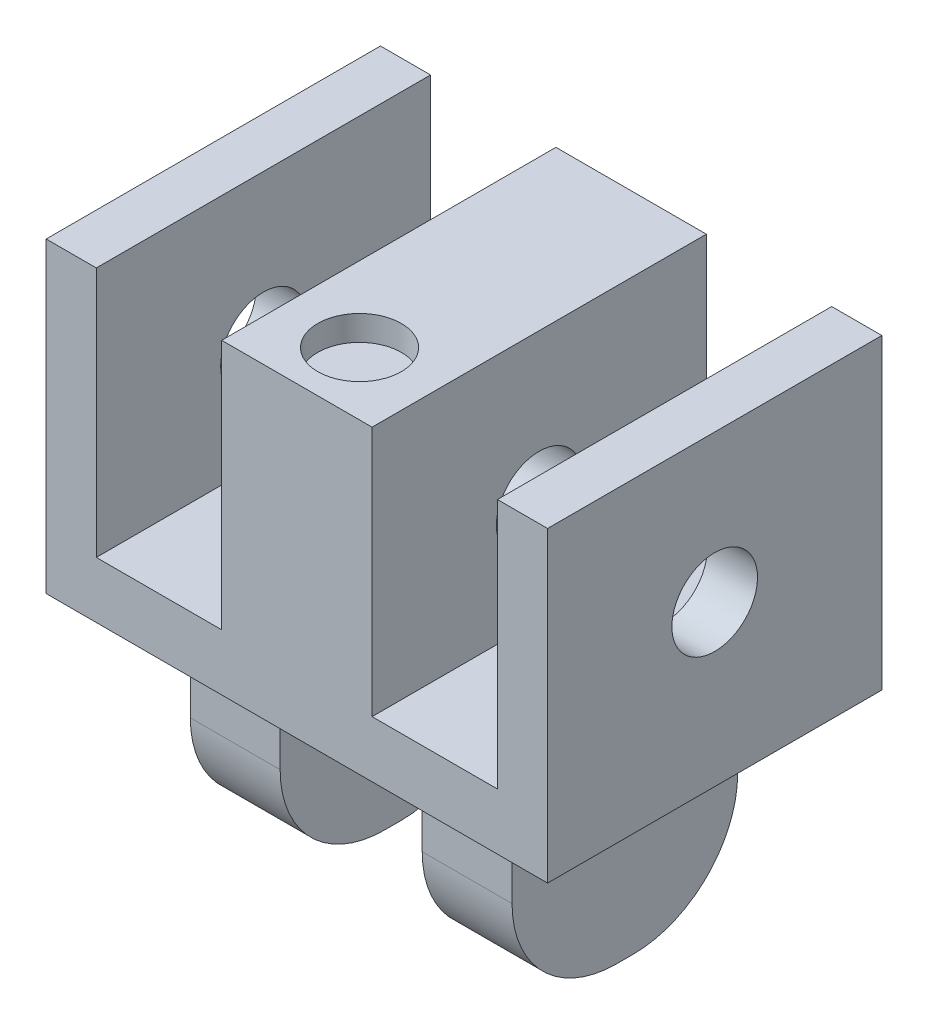
ISO-10303-21;
HEADER;
FILE_DESCRIPTION(('STEP AP214'),'2;1');
FILE_NAME('part.step','',(''),(''),'','','');
FILE_SCHEMA(('AUTOMOTIVE_DESIGN { 1 0 10303 214 1 1 1 1 }'));
ENDSEC;
DATA;
#1=APPLICATION_CONTEXT('core data for automotive mechanical design processes');
#2=APPLICATION_PROTOCOL_DEFINITION('international standard','automotive_design',2000,#1);
#3=PRODUCT_CONTEXT('',#1,'mechanical');
#4=PRODUCT('Part','Part','',(#3));
#5=PRODUCT_RELATED_PRODUCT_CATEGORY('part','',(#4));
#6=PRODUCT_DEFINITION_FORMATION('','',#4);
#7=PRODUCT_DEFINITION_CONTEXT('part definition',#1,'design');
#8=PRODUCT_DEFINITION('design','',#6,#7);
#9=PRODUCT_DEFINITION_SHAPE('','',#8);
#10=(LENGTH_UNIT() NAMED_UNIT(*) SI_UNIT(.MILLI.,.METRE.));
#11=(NAMED_UNIT(*) PLANE_ANGLE_UNIT() SI_UNIT($,.RADIAN.));
#12=(NAMED_UNIT(*) SI_UNIT($,.STERADIAN.) SOLID_ANGLE_UNIT());
#13=UNCERTAINTY_MEASURE_WITH_UNIT(LENGTH_MEASURE(1.E-05),#10,'distance_accuracy_value','');
#14=(GEOMETRIC_REPRESENTATION_CONTEXT(3) GLOBAL_UNCERTAINTY_ASSIGNED_CONTEXT((#13)) GLOBAL_UNIT_ASSIGNED_CONTEXT((#10,
#11,#12)) REPRESENTATION_CONTEXT('',''));
#15=CARTESIAN_POINT('',(0.,0.,0.));
#16=DIRECTION('',(0.,0.,1.));
#17=DIRECTION('',(1.,0.,0.));
#18=AXIS2_PLACEMENT_3D('',#15,#16,#17);
#19=CARTESIAN_POINT('',(0.,60.,54.));
#20=DIRECTION('',(0.,1.,0.));
#21=DIRECTION('',(0.,0.,1.));
#22=AXIS2_PLACEMENT_3D('',#19,#20,#21);
#23=PLANE('',#22);
#24=DIRECTION('',(0.,0.,1.));
#25=VECTOR('',#24,1.);
#26=CARTESIAN_POINT('',(-48.,60.,-13.));
#27=LINE('',#26,#25);
#28=CARTESIAN_POINT('',(-48.,60.,-13.));
#29=VERTEX_POINT('',#28);
#30=CARTESIAN_POINT('',(-48.,60.,67.));
#31=VERTEX_POINT('',#30);
#32=EDGE_CURVE('E264',#29,#31,#27,.T.);
#33=ORIENTED_EDGE('',*,*,#32,.F.);
#34=DIRECTION('',(-1.,0.,0.));
#35=VECTOR('',#34,1.);
#36=CARTESIAN_POINT('',(60.,60.,-13.));
#37=LINE('',#36,#35);
#38=CARTESIAN_POINT('',(-60.,60.,-13.));
#39=VERTEX_POINT('',#38);
#40=EDGE_CURVE('E304',#29,#39,#37,.T.);
#41=ORIENTED_EDGE('',*,*,#40,.T.);
#42=DIRECTION('',(0.,0.,-1.));
#43=VECTOR('',#42,1.);
#44=CARTESIAN_POINT('',(-60.,60.,54.));
#45=LINE('',#44,#43);
#46=CARTESIAN_POINT('',(-60.,60.,67.));
#47=VERTEX_POINT('',#46);
#48=EDGE_CURVE('E395',#47,#39,#45,.T.);
#49=ORIENTED_EDGE('',*,*,#48,.F.);
#50=DIRECTION('',(1.,0.,0.));
#51=VECTOR('',#50,1.);
#52=CARTESIAN_POINT('',(-60.,60.,67.));
#53=LINE('',#52,#51);
#54=EDGE_CURVE('E300',#47,#31,#53,.T.);
#55=ORIENTED_EDGE('',*,*,#54,.T.);
#56=EDGE_LOOP('',(#33,#41,#49,#55));
#57=FACE_BOUND('',#56,.T.);
#58=ADVANCED_FACE('F47',(#57),#23,.T.);
#59=DIRECTION('',(0.,0.,-1.));
#60=VECTOR('',#59,1.);
#61=CARTESIAN_POINT('',(48.,60.,-13.));
#62=LINE('',#61,#60);
#63=CARTESIAN_POINT('',(48.,60.,67.));
#64=VERTEX_POINT('',#63);
#65=CARTESIAN_POINT('',(48.,60.,-13.));
#66=VERTEX_POINT('',#65);
#67=EDGE_CURVE('E257',#64,#66,#62,.T.);
#68=ORIENTED_EDGE('',*,*,#67,.F.);
#69=CARTESIAN_POINT('',(60.,60.,67.));
#70=VERTEX_POINT('',#69);
#71=EDGE_CURVE('E305',#64,#70,#53,.T.);
#72=ORIENTED_EDGE('',*,*,#71,.T.);
#73=DIRECTION('',(0.,0.,-1.));
#74=VECTOR('',#73,1.);
#75=CARTESIAN_POINT('',(60.,60.,54.));
#76=LINE('',#75,#74);
#77=CARTESIAN_POINT('',(60.,60.,-13.));
#78=VERTEX_POINT('',#77);
#79=EDGE_CURVE('E404',#70,#78,#76,.T.);
#80=ORIENTED_EDGE('',*,*,#79,.T.);
#81=EDGE_CURVE('E314',#78,#66,#37,.T.);
#82=ORIENTED_EDGE('',*,*,#81,.T.);
#83=EDGE_LOOP('',(#68,#72,#80,#82));
#84=FACE_BOUND('',#83,.T.);
#85=ADVANCED_FACE('F545',(#84),#23,.T.);
#86=CARTESIAN_POINT('',(-60.,24.75,27.));
#87=DIRECTION('',(1.,0.,0.));
#88=DIRECTION('',(0.,1.,0.));
#89=AXIS2_PLACEMENT_3D('',#86,#87,#88);
#90=CYLINDRICAL_SURFACE('',#89,10.25);
#91=CARTESIAN_POINT('',(-48.,24.75,27.));
#92=DIRECTION('',(-1.,0.,0.));
#93=DIRECTION('',(0.,0.,1.));
#94=AXIS2_PLACEMENT_3D('',#91,#92,#93);
#95=CIRCLE('',#94,10.25);
#96=CARTESIAN_POINT('',(-48.,24.75,37.25));
#97=VERTEX_POINT('',#96);
#98=EDGE_CURVE('E287',#97,#97,#95,.F.);
#99=ORIENTED_EDGE('',*,*,#98,.T.);
#100=EDGE_LOOP('',(#99));
#101=FACE_BOUND('',#100,.T.);
#102=CARTESIAN_POINT('',(-60.,24.75,27.));
#103=DIRECTION('',(1.,0.,0.));
#104=DIRECTION('',(0.,1.,0.));
#105=AXIS2_PLACEMENT_3D('',#102,#103,#104);
#106=CIRCLE('',#105,10.25);
#107=CARTESIAN_POINT('',(-60.,35.,27.));
#108=VERTEX_POINT('',#107);
#109=EDGE_CURVE('E369',#108,#108,#106,.T.);
#110=ORIENTED_EDGE('',*,*,#109,.F.);
#111=EDGE_LOOP('',(#110));
#112=FACE_BOUND('',#111,.T.);
#113=ADVANCED_FACE('F565',(#101,#112),#90,.F.);
#114=CARTESIAN_POINT('',(48.,24.75,27.));
#115=DIRECTION('',(1.,0.,0.));
#116=DIRECTION('',(0.,0.,-1.));
#117=AXIS2_PLACEMENT_3D('',#114,#115,#116);
#118=CIRCLE('',#117,10.25);
#119=CARTESIAN_POINT('',(48.,24.75,16.75));
#120=VERTEX_POINT('',#119);
#121=EDGE_CURVE('E279',#120,#120,#118,.F.);
#122=ORIENTED_EDGE('',*,*,#121,.T.);
#123=EDGE_LOOP('',(#122));
#124=FACE_BOUND('',#123,.T.);
#125=CARTESIAN_POINT('',(60.,24.75,27.));
#126=DIRECTION('',(1.,0.,0.));
#127=DIRECTION('',(0.,1.,0.));
#128=AXIS2_PLACEMENT_3D('',#125,#126,#127);
#129=CIRCLE('',#128,10.25);
#130=CARTESIAN_POINT('',(60.,35.,27.));
#131=VERTEX_POINT('',#130);
#132=EDGE_CURVE('E373',#131,#131,#129,.T.);
#133=ORIENTED_EDGE('',*,*,#132,.T.);
#134=EDGE_LOOP('',(#133));
#135=FACE_BOUND('',#134,.T.);
#136=ADVANCED_FACE('F568',(#124,#135),#90,.F.);
#137=CARTESIAN_POINT('',(0.,0.,54.));
#138=DIRECTION('',(0.,0.,1.));
#139=DIRECTION('',(1.,0.,0.));
#140=AXIS2_PLACEMENT_3D('',#137,#138,#139);
#141=PLANE('',#140);
#142=DIRECTION('',(0.,-1.,0.));
#143=VECTOR('',#142,1.);
#144=CARTESIAN_POINT('',(38.5,0.,54.));
#145=LINE('',#144,#143);
#146=CARTESIAN_POINT('',(38.5,-13.5,54.));
#147=VERTEX_POINT('',#146);
#148=CARTESIAN_POINT('',(38.5,-35.,54.));
#149=VERTEX_POINT('',#148);
#150=EDGE_CURVE('E360',#147,#149,#145,.T.);
#151=ORIENTED_EDGE('',*,*,#150,.F.);
#152=DIRECTION('',(-1.,0.,0.));
#153=VECTOR('',#152,1.);
#154=CARTESIAN_POINT('',(0.,-13.5,54.));
#155=LINE('',#154,#153);
#156=CARTESIAN_POINT('',(17.,-13.5,54.));
#157=VERTEX_POINT('',#156);
#158=EDGE_CURVE('E11',#147,#157,#155,.T.);
#159=ORIENTED_EDGE('',*,*,#158,.T.);
#160=DIRECTION('',(0.,1.,0.));
#161=VECTOR('',#160,1.);
#162=CARTESIAN_POINT('',(17.,0.,54.));
#163=LINE('',#162,#161);
#164=CARTESIAN_POINT('',(17.,-35.,54.));
#165=VERTEX_POINT('',#164);
#166=EDGE_CURVE('E390',#165,#157,#163,.T.);
#167=ORIENTED_EDGE('',*,*,#166,.F.);
#168=DIRECTION('',(1.,0.,0.));
#169=VECTOR('',#168,1.);
#170=CARTESIAN_POINT('',(38.5,-35.,54.));
#171=LINE('',#170,#169);
#172=EDGE_CURVE('E423',#165,#149,#171,.T.);
#173=ORIENTED_EDGE('',*,*,#172,.T.);
#174=EDGE_LOOP('',(#151,#159,#167,#173));
#175=FACE_BOUND('',#174,.T.);
#176=ADVANCED_FACE('F636',(#175),#141,.T.);
#177=DIRECTION('',(0.,1.,0.));
#178=VECTOR('',#177,1.);
#179=CARTESIAN_POINT('',(-17.,0.,54.));
#180=LINE('',#179,#178);
#181=CARTESIAN_POINT('',(-17.,-35.,54.));
#182=VERTEX_POINT('',#181);
#183=CARTESIAN_POINT('',(-17.,-13.5,54.));
#184=VERTEX_POINT('',#183);
#185=EDGE_CURVE('E386',#182,#184,#180,.T.);
#186=ORIENTED_EDGE('',*,*,#185,.T.);
#187=CARTESIAN_POINT('',(-38.5,-13.5,54.));
#188=VERTEX_POINT('',#187);
#189=EDGE_CURVE('E51',#184,#188,#155,.T.);
#190=ORIENTED_EDGE('',*,*,#189,.T.);
#191=DIRECTION('',(0.,1.,0.));
#192=VECTOR('',#191,1.);
#193=CARTESIAN_POINT('',(-38.5,0.,54.));
#194=LINE('',#193,#192);
#195=CARTESIAN_POINT('',(-38.5,-35.,54.));
#196=VERTEX_POINT('',#195);
#197=EDGE_CURVE('E365',#196,#188,#194,.T.);
#198=ORIENTED_EDGE('',*,*,#197,.F.);
#199=DIRECTION('',(1.,0.,0.));
#200=VECTOR('',#199,1.);
#201=CARTESIAN_POINT('',(-17.,-35.,54.));
#202=LINE('',#201,#200);
#203=EDGE_CURVE('E433',#196,#182,#202,.T.);
#204=ORIENTED_EDGE('',*,*,#203,.T.);
#205=EDGE_LOOP('',(#186,#190,#198,#204));
#206=FACE_BOUND('',#205,.T.);
#207=ADVANCED_FACE('F486',(#206),#141,.T.);
#208=CARTESIAN_POINT('',(0.,0.,0.));
#209=DIRECTION('',(0.,0.,1.));
#210=DIRECTION('',(1.,0.,0.));
#211=AXIS2_PLACEMENT_3D('',#208,#209,#210);
#212=PLANE('',#211);
#213=DIRECTION('',(1.,0.,0.));
#214=VECTOR('',#213,1.);
#215=CARTESIAN_POINT('',(60.,-13.5,0.));
#216=LINE('',#215,#214);
#217=CARTESIAN_POINT('',(17.,-13.5,0.));
#218=VERTEX_POINT('',#217);
#219=CARTESIAN_POINT('',(38.5,-13.5,0.));
#220=VERTEX_POINT('',#219);
#221=EDGE_CURVE('E313',#218,#220,#216,.T.);
#222=ORIENTED_EDGE('',*,*,#221,.T.);
#223=DIRECTION('',(0.,-1.,0.));
#224=VECTOR('',#223,1.);
#225=CARTESIAN_POINT('',(38.5,-60.,0.));
#226=LINE('',#225,#224);
#227=CARTESIAN_POINT('',(38.5,-35.,0.));
#228=VERTEX_POINT('',#227);
#229=EDGE_CURVE('E335',#220,#228,#226,.T.);
#230=ORIENTED_EDGE('',*,*,#229,.T.);
#231=DIRECTION('',(1.,0.,0.));
#232=VECTOR('',#231,1.);
#233=CARTESIAN_POINT('',(0.,-35.,0.));
#234=LINE('',#233,#232);
#235=CARTESIAN_POINT('',(17.,-35.,0.));
#236=VERTEX_POINT('',#235);
#237=EDGE_CURVE('E456',#228,#236,#234,.F.);
#238=ORIENTED_EDGE('',*,*,#237,.T.);
#239=DIRECTION('',(0.,1.,0.));
#240=VECTOR('',#239,1.);
#241=CARTESIAN_POINT('',(17.,0.,0.));
#242=LINE('',#241,#240);
#243=EDGE_CURVE('E391',#236,#218,#242,.T.);
#244=ORIENTED_EDGE('',*,*,#243,.T.);
#245=EDGE_LOOP('',(#222,#230,#238,#244));
#246=FACE_BOUND('',#245,.T.);
#247=ADVANCED_FACE('F641',(#246),#212,.F.);
#248=CARTESIAN_POINT('',(-38.5,-13.5,0.));
#249=VERTEX_POINT('',#248);
#250=CARTESIAN_POINT('',(-17.,-13.5,0.));
#251=VERTEX_POINT('',#250);
#252=EDGE_CURVE('E317',#249,#251,#216,.T.);
#253=ORIENTED_EDGE('',*,*,#252,.T.);
#254=DIRECTION('',(0.,1.,0.));
#255=VECTOR('',#254,1.);
#256=CARTESIAN_POINT('',(-17.,0.,0.));
#257=LINE('',#256,#255);
#258=CARTESIAN_POINT('',(-17.,-35.,0.));
#259=VERTEX_POINT('',#258);
#260=EDGE_CURVE('E385',#259,#251,#257,.T.);
#261=ORIENTED_EDGE('',*,*,#260,.F.);
#262=DIRECTION('',(1.,0.,0.));
#263=VECTOR('',#262,1.);
#264=CARTESIAN_POINT('',(0.,-35.,0.));
#265=LINE('',#264,#263);
#266=CARTESIAN_POINT('',(-38.5,-35.,0.));
#267=VERTEX_POINT('',#266);
#268=EDGE_CURVE('E459',#259,#267,#265,.F.);
#269=ORIENTED_EDGE('',*,*,#268,.T.);
#270=DIRECTION('',(0.,1.,0.));
#271=VECTOR('',#270,1.);
#272=CARTESIAN_POINT('',(-38.5,-60.,0.));
#273=LINE('',#272,#271);
#274=EDGE_CURVE('E331',#267,#249,#273,.T.);
#275=ORIENTED_EDGE('',*,*,#274,.T.);
#276=EDGE_LOOP('',(#253,#261,#269,#275));
#277=FACE_BOUND('',#276,.T.);
#278=ADVANCED_FACE('F643',(#277),#212,.F.);
#279=CARTESIAN_POINT('',(0.,-60.,54.));
#280=DIRECTION('',(0.,1.,0.));
#281=DIRECTION('',(0.,0.,1.));
#282=AXIS2_PLACEMENT_3D('',#279,#280,#281);
#283=PLANE('',#282);
#284=DIRECTION('',(0.,0.,-1.));
#285=VECTOR('',#284,1.);
#286=CARTESIAN_POINT('',(-17.,-60.,54.));
#287=LINE('',#286,#285);
#288=CARTESIAN_POINT('',(-17.,-60.,29.));
#289=VERTEX_POINT('',#288);
#290=CARTESIAN_POINT('',(-17.,-60.,25.));
#291=VERTEX_POINT('',#290);
#292=EDGE_CURVE('E419',#289,#291,#287,.T.);
#293=ORIENTED_EDGE('',*,*,#292,.F.);
#294=DIRECTION('',(1.,0.,0.));
#295=VECTOR('',#294,1.);
#296=CARTESIAN_POINT('',(-38.5,-60.,29.));
#297=LINE('',#296,#295);
#298=CARTESIAN_POINT('',(-38.5,-60.,29.));
#299=VERTEX_POINT('',#298);
#300=EDGE_CURVE('E447',#289,#299,#297,.F.);
#301=ORIENTED_EDGE('',*,*,#300,.T.);
#302=DIRECTION('',(0.,0.,1.));
#303=VECTOR('',#302,1.);
#304=CARTESIAN_POINT('',(-38.5,-60.,0.));
#305=LINE('',#304,#303);
#306=CARTESIAN_POINT('',(-38.5,-60.,25.));
#307=VERTEX_POINT('',#306);
#308=EDGE_CURVE('E334',#307,#299,#305,.T.);
#309=ORIENTED_EDGE('',*,*,#308,.F.);
#310=DIRECTION('',(1.,0.,0.));
#311=VECTOR('',#310,1.);
#312=CARTESIAN_POINT('',(0.,-60.,25.));
#313=LINE('',#312,#311);
#314=EDGE_CURVE('E443',#307,#291,#313,.T.);
#315=ORIENTED_EDGE('',*,*,#314,.T.);
#316=EDGE_LOOP('',(#293,#301,#309,#315));
#317=FACE_BOUND('',#316,.T.);
#318=ADVANCED_FACE('F598',(#317),#283,.F.);
#319=CARTESIAN_POINT('',(-17.,0.,54.));
#320=DIRECTION('',(-1.,0.,0.));
#321=DIRECTION('',(0.,-1.,0.));
#322=AXIS2_PLACEMENT_3D('',#319,#320,#321);
#323=PLANE('',#322);
#324=CARTESIAN_POINT('',(-17.,-24.75,27.));
#325=DIRECTION('',(-1.,0.,0.));
#326=DIRECTION('',(0.,-1.,0.));
#327=AXIS2_PLACEMENT_3D('',#324,#325,#326);
#328=CIRCLE('',#327,10.25);
#329=CARTESIAN_POINT('',(-17.,-35.,27.));
#330=VERTEX_POINT('',#329);
#331=EDGE_CURVE('E381',#330,#330,#328,.T.);
#332=ORIENTED_EDGE('',*,*,#331,.T.);
#333=EDGE_LOOP('',(#332));
#334=FACE_BOUND('',#333,.T.);
#335=ORIENTED_EDGE('',*,*,#185,.F.);
#336=CARTESIAN_POINT('',(-17.,-35.,29.));
#337=DIRECTION('',(-1.,0.,0.));
#338=DIRECTION('',(0.,-1.,0.));
#339=AXIS2_PLACEMENT_3D('',#336,#337,#338);
#340=CIRCLE('',#339,25.);
#341=EDGE_CURVE('E440',#182,#289,#340,.F.);
#342=ORIENTED_EDGE('',*,*,#341,.T.);
#343=ORIENTED_EDGE('',*,*,#292,.T.);
#344=CARTESIAN_POINT('',(-17.,-35.,25.));
#345=DIRECTION('',(-1.,0.,0.));
#346=DIRECTION('',(0.,-1.,0.));
#347=AXIS2_PLACEMENT_3D('',#344,#345,#346);
#348=CIRCLE('',#347,25.);
#349=EDGE_CURVE('E437',#291,#259,#348,.F.);
#350=ORIENTED_EDGE('',*,*,#349,.T.);
#351=ORIENTED_EDGE('',*,*,#260,.T.);
#352=DIRECTION('',(0.,0.,-1.));
#353=VECTOR('',#352,1.);
#354=CARTESIAN_POINT('',(-17.,-13.5,54.));
#355=LINE('',#354,#353);
#356=EDGE_CURVE('E415',#184,#251,#355,.T.);
#357=ORIENTED_EDGE('',*,*,#356,.F.);
#358=EDGE_LOOP('',(#335,#342,#343,#350,#351,#357));
#359=FACE_BOUND('',#358,.T.);
#360=ADVANCED_FACE('F604',(#334,#359),#323,.F.);
#361=CARTESIAN_POINT('',(0.,-13.5,54.));
#362=DIRECTION('',(0.,-1.,0.));
#363=DIRECTION('',(1.,0.,0.));
#364=AXIS2_PLACEMENT_3D('',#361,#362,#363);
#365=PLANE('',#364);
#366=ORIENTED_EDGE('',*,*,#158,.F.);
#367=DIRECTION('',(0.,0.,1.));
#368=VECTOR('',#367,1.);
#369=CARTESIAN_POINT('',(38.5,-13.5,0.));
#370=LINE('',#369,#368);
#371=EDGE_CURVE('E350',#220,#147,#370,.T.);
#372=ORIENTED_EDGE('',*,*,#371,.F.);
#373=ORIENTED_EDGE('',*,*,#221,.F.);
#374=DIRECTION('',(0.,0.,-1.));
#375=VECTOR('',#374,1.);
#376=CARTESIAN_POINT('',(17.,-13.5,54.));
#377=LINE('',#376,#375);
#378=EDGE_CURVE('E411',#157,#218,#377,.T.);
#379=ORIENTED_EDGE('',*,*,#378,.F.);
#380=EDGE_LOOP('',(#366,#372,#373,#379));
#381=FACE_BOUND('',#380,.T.);
#382=ORIENTED_EDGE('',*,*,#189,.F.);
#383=ORIENTED_EDGE('',*,*,#356,.T.);
#384=ORIENTED_EDGE('',*,*,#252,.F.);
#385=DIRECTION('',(0.,0.,1.));
#386=VECTOR('',#385,1.);
#387=CARTESIAN_POINT('',(-38.5,-13.5,0.));
#388=LINE('',#387,#386);
#389=EDGE_CURVE('E340',#249,#188,#388,.T.);
#390=ORIENTED_EDGE('',*,*,#389,.T.);
#391=EDGE_LOOP('',(#382,#383,#384,#390));
#392=FACE_BOUND('',#391,.T.);
#393=DIRECTION('',(0.,0.,1.));
#394=VECTOR('',#393,1.);
#395=CARTESIAN_POINT('',(60.,-13.5,0.));
#396=LINE('',#395,#394);
#397=CARTESIAN_POINT('',(60.,-13.5,-13.));
#398=VERTEX_POINT('',#397);
#399=CARTESIAN_POINT('',(60.,-13.5,67.));
#400=VERTEX_POINT('',#399);
#401=EDGE_CURVE('E347',#398,#400,#396,.T.);
#402=ORIENTED_EDGE('',*,*,#401,.T.);
#403=DIRECTION('',(1.,0.,0.));
#404=VECTOR('',#403,1.);
#405=CARTESIAN_POINT('',(-60.,-13.5,67.));
#406=LINE('',#405,#404);
#407=CARTESIAN_POINT('',(-60.,-13.5,67.));
#408=VERTEX_POINT('',#407);
#409=EDGE_CURVE('E296',#408,#400,#406,.T.);
#410=ORIENTED_EDGE('',*,*,#409,.F.);
#411=DIRECTION('',(0.,0.,1.));
#412=VECTOR('',#411,1.);
#413=CARTESIAN_POINT('',(-60.,-13.5,0.));
#414=LINE('',#413,#412);
#415=CARTESIAN_POINT('',(-60.,-13.5,-13.));
#416=VERTEX_POINT('',#415);
#417=EDGE_CURVE('E336',#416,#408,#414,.T.);
#418=ORIENTED_EDGE('',*,*,#417,.F.);
#419=DIRECTION('',(-1.,0.,0.));
#420=VECTOR('',#419,1.);
#421=CARTESIAN_POINT('',(60.,-13.5,-13.));
#422=LINE('',#421,#420);
#423=EDGE_CURVE('E309',#398,#416,#422,.T.);
#424=ORIENTED_EDGE('',*,*,#423,.F.);
#425=EDGE_LOOP('',(#402,#410,#418,#424));
#426=FACE_BOUND('',#425,.T.);
#427=ADVANCED_FACE('F498',(#381,#392,#426),#365,.T.);
#428=CARTESIAN_POINT('',(17.,0.,54.));
#429=DIRECTION('',(-1.,0.,0.));
#430=DIRECTION('',(0.,-1.,0.));
#431=AXIS2_PLACEMENT_3D('',#428,#429,#430);
#432=PLANE('',#431);
#433=CARTESIAN_POINT('',(17.,-24.75,27.));
#434=DIRECTION('',(-1.,0.,0.));
#435=DIRECTION('',(0.,-1.,0.));
#436=AXIS2_PLACEMENT_3D('',#433,#434,#435);
#437=CIRCLE('',#436,10.25);
#438=CARTESIAN_POINT('',(17.,-35.,27.));
#439=VERTEX_POINT('',#438);
#440=EDGE_CURVE('E377',#439,#439,#437,.T.);
#441=ORIENTED_EDGE('',*,*,#440,.F.);
#442=EDGE_LOOP('',(#441));
#443=FACE_BOUND('',#442,.T.);
#444=ORIENTED_EDGE('',*,*,#243,.F.);
#445=CARTESIAN_POINT('',(17.,-35.,25.));
#446=DIRECTION('',(-1.,0.,0.));
#447=DIRECTION('',(0.,-1.,0.));
#448=AXIS2_PLACEMENT_3D('',#445,#446,#447);
#449=CIRCLE('',#448,25.);
#450=CARTESIAN_POINT('',(17.,-60.,25.));
#451=VERTEX_POINT('',#450);
#452=EDGE_CURVE('E477',#236,#451,#449,.T.);
#453=ORIENTED_EDGE('',*,*,#452,.T.);
#454=DIRECTION('',(0.,0.,-1.));
#455=VECTOR('',#454,1.);
#456=CARTESIAN_POINT('',(17.,-60.,54.));
#457=LINE('',#456,#455);
#458=CARTESIAN_POINT('',(17.,-60.,29.));
#459=VERTEX_POINT('',#458);
#460=EDGE_CURVE('E407',#459,#451,#457,.T.);
#461=ORIENTED_EDGE('',*,*,#460,.F.);
#462=CARTESIAN_POINT('',(17.,-35.,29.));
#463=DIRECTION('',(-1.,0.,0.));
#464=DIRECTION('',(0.,-1.,0.));
#465=AXIS2_PLACEMENT_3D('',#462,#463,#464);
#466=CIRCLE('',#465,25.);
#467=EDGE_CURVE('E475',#459,#165,#466,.T.);
#468=ORIENTED_EDGE('',*,*,#467,.T.);
#469=ORIENTED_EDGE('',*,*,#166,.T.);
#470=ORIENTED_EDGE('',*,*,#378,.T.);
#471=EDGE_LOOP('',(#444,#453,#461,#468,#469,#470));
#472=FACE_BOUND('',#471,.T.);
#473=ADVANCED_FACE('F596',(#443,#472),#432,.T.);
#474=ORIENTED_EDGE('',*,*,#460,.T.);
#475=DIRECTION('',(1.,0.,0.));
#476=VECTOR('',#475,1.);
#477=CARTESIAN_POINT('',(0.,-60.,25.));
#478=LINE('',#477,#476);
#479=CARTESIAN_POINT('',(38.5,-60.,25.));
#480=VERTEX_POINT('',#479);
#481=EDGE_CURVE('E465',#451,#480,#478,.T.);
#482=ORIENTED_EDGE('',*,*,#481,.T.);
#483=DIRECTION('',(0.,0.,1.));
#484=VECTOR('',#483,1.);
#485=CARTESIAN_POINT('',(38.5,-60.,0.));
#486=LINE('',#485,#484);
#487=CARTESIAN_POINT('',(38.5,-60.,29.));
#488=VERTEX_POINT('',#487);
#489=EDGE_CURVE('E326',#480,#488,#486,.T.);
#490=ORIENTED_EDGE('',*,*,#489,.T.);
#491=DIRECTION('',(1.,0.,0.));
#492=VECTOR('',#491,1.);
#493=CARTESIAN_POINT('',(17.,-60.,29.));
#494=LINE('',#493,#492);
#495=EDGE_CURVE('E462',#488,#459,#494,.F.);
#496=ORIENTED_EDGE('',*,*,#495,.T.);
#497=EDGE_LOOP('',(#474,#482,#490,#496));
#498=FACE_BOUND('',#497,.T.);
#499=ADVANCED_FACE('F592',(#498),#283,.F.);
#500=CARTESIAN_POINT('',(60.,0.,54.));
#501=DIRECTION('',(1.,0.,0.));
#502=DIRECTION('',(0.,1.,0.));
#503=AXIS2_PLACEMENT_3D('',#500,#501,#502);
#504=PLANE('',#503);
#505=ORIENTED_EDGE('',*,*,#401,.F.);
#506=DIRECTION('',(0.,1.,0.));
#507=VECTOR('',#506,1.);
#508=CARTESIAN_POINT('',(60.,-13.5,-13.));
#509=LINE('',#508,#507);
#510=EDGE_CURVE('E327',#398,#78,#509,.T.);
#511=ORIENTED_EDGE('',*,*,#510,.T.);
#512=ORIENTED_EDGE('',*,*,#79,.F.);
#513=DIRECTION('',(0.,1.,0.));
#514=VECTOR('',#513,1.);
#515=CARTESIAN_POINT('',(60.,-13.5,67.));
#516=LINE('',#515,#514);
#517=EDGE_CURVE('E291',#400,#70,#516,.T.);
#518=ORIENTED_EDGE('',*,*,#517,.F.);
#519=EDGE_LOOP('',(#505,#511,#512,#518));
#520=FACE_BOUND('',#519,.T.);
#521=ORIENTED_EDGE('',*,*,#132,.F.);
#522=EDGE_LOOP('',(#521));
#523=FACE_BOUND('',#522,.T.);
#524=ADVANCED_FACE('F543',(#520,#523),#504,.T.);
#525=CARTESIAN_POINT('',(0.,60.,52.));
#526=DIRECTION('',(0.,1.,0.));
#527=DIRECTION('',(0.,0.,1.));
#528=AXIS2_PLACEMENT_3D('',#525,#526,#527);
#529=CIRCLE('',#528,10.);
#530=CARTESIAN_POINT('',(0.,60.,62.));
#531=VERTEX_POINT('',#530);
#532=EDGE_CURVE('E522',#531,#531,#529,.T.);
#533=ORIENTED_EDGE('',*,*,#532,.F.);
#534=EDGE_LOOP('',(#533));
#535=FACE_BOUND('',#534,.T.);
#536=DIRECTION('',(0.,0.,-1.));
#537=VECTOR('',#536,1.);
#538=CARTESIAN_POINT('',(-18.,60.,-13.));
#539=LINE('',#538,#537);
#540=CARTESIAN_POINT('',(-18.,60.,67.));
#541=VERTEX_POINT('',#540);
#542=CARTESIAN_POINT('',(-18.,60.,-13.));
#543=VERTEX_POINT('',#542);
#544=EDGE_CURVE('E513',#541,#543,#539,.T.);
#545=ORIENTED_EDGE('',*,*,#544,.F.);
#546=CARTESIAN_POINT('',(18.,60.,67.));
#547=VERTEX_POINT('',#546);
#548=EDGE_CURVE('E231',#541,#547,#53,.T.);
#549=ORIENTED_EDGE('',*,*,#548,.T.);
#550=DIRECTION('',(0.,0.,1.));
#551=VECTOR('',#550,1.);
#552=CARTESIAN_POINT('',(18.,60.,-13.));
#553=LINE('',#552,#551);
#554=CARTESIAN_POINT('',(18.,60.,-13.));
#555=VERTEX_POINT('',#554);
#556=EDGE_CURVE('E260',#555,#547,#553,.T.);
#557=ORIENTED_EDGE('',*,*,#556,.F.);
#558=EDGE_CURVE('E321',#555,#543,#37,.T.);
#559=ORIENTED_EDGE('',*,*,#558,.T.);
#560=EDGE_LOOP('',(#545,#549,#557,#559));
#561=FACE_BOUND('',#560,.T.);
#562=ADVANCED_FACE('F539',(#535,#561),#23,.T.);
#563=CARTESIAN_POINT('',(-60.,0.,54.));
#564=DIRECTION('',(1.,0.,0.));
#565=DIRECTION('',(0.,1.,0.));
#566=AXIS2_PLACEMENT_3D('',#563,#564,#565);
#567=PLANE('',#566);
#568=ORIENTED_EDGE('',*,*,#109,.T.);
#569=EDGE_LOOP('',(#568));
#570=FACE_BOUND('',#569,.T.);
#571=ORIENTED_EDGE('',*,*,#48,.T.);
#572=DIRECTION('',(0.,1.,0.));
#573=VECTOR('',#572,1.);
#574=CARTESIAN_POINT('',(-60.,-13.5,-13.));
#575=LINE('',#574,#573);
#576=EDGE_CURVE('E322',#416,#39,#575,.T.);
#577=ORIENTED_EDGE('',*,*,#576,.F.);
#578=ORIENTED_EDGE('',*,*,#417,.T.);
#579=DIRECTION('',(0.,1.,0.));
#580=VECTOR('',#579,1.);
#581=CARTESIAN_POINT('',(-60.,-13.5,67.));
#582=LINE('',#581,#580);
#583=EDGE_CURVE('E292',#408,#47,#582,.T.);
#584=ORIENTED_EDGE('',*,*,#583,.T.);
#585=EDGE_LOOP('',(#571,#577,#578,#584));
#586=FACE_BOUND('',#585,.T.);
#587=ADVANCED_FACE('F542',(#570,#586),#567,.F.);
#588=CARTESIAN_POINT('',(-60.,-24.75,27.));
#589=DIRECTION('',(1.,0.,0.));
#590=DIRECTION('',(0.,1.,0.));
#591=AXIS2_PLACEMENT_3D('',#588,#589,#590);
#592=CYLINDRICAL_SURFACE('',#591,10.25);
#593=CARTESIAN_POINT('',(-38.5,-24.75,27.));
#594=DIRECTION('',(1.,0.,0.));
#595=DIRECTION('',(0.,0.,-1.));
#596=AXIS2_PLACEMENT_3D('',#593,#594,#595);
#597=CIRCLE('',#596,10.25);
#598=CARTESIAN_POINT('',(-38.5,-24.75,16.75));
#599=VERTEX_POINT('',#598);
#600=EDGE_CURVE('E364',#599,#599,#597,.F.);
#601=ORIENTED_EDGE('',*,*,#600,.T.);
#602=EDGE_LOOP('',(#601));
#603=FACE_BOUND('',#602,.T.);
#604=ORIENTED_EDGE('',*,*,#331,.F.);
#605=EDGE_LOOP('',(#604));
#606=FACE_BOUND('',#605,.T.);
#607=ADVANCED_FACE('F573',(#603,#606),#592,.F.);
#608=CARTESIAN_POINT('',(38.5,-24.75,27.));
#609=DIRECTION('',(-1.,0.,0.));
#610=DIRECTION('',(0.,0.,1.));
#611=AXIS2_PLACEMENT_3D('',#608,#609,#610);
#612=CIRCLE('',#611,10.25);
#613=CARTESIAN_POINT('',(38.5,-24.75,37.25));
#614=VERTEX_POINT('',#613);
#615=EDGE_CURVE('E339',#614,#614,#612,.F.);
#616=ORIENTED_EDGE('',*,*,#615,.T.);
#617=EDGE_LOOP('',(#616));
#618=FACE_BOUND('',#617,.T.);
#619=ORIENTED_EDGE('',*,*,#440,.T.);
#620=EDGE_LOOP('',(#619));
#621=FACE_BOUND('',#620,.T.);
#622=ADVANCED_FACE('F580',(#618,#621),#592,.F.);
#623=CARTESIAN_POINT('',(38.5,-60.,0.));
#624=DIRECTION('',(-1.,0.,0.));
#625=DIRECTION('',(0.,0.,1.));
#626=AXIS2_PLACEMENT_3D('',#623,#624,#625);
#627=PLANE('',#626);
#628=ORIENTED_EDGE('',*,*,#489,.F.);
#629=CARTESIAN_POINT('',(38.5,-35.,25.));
#630=DIRECTION('',(-1.,0.,0.));
#631=DIRECTION('',(0.,0.,1.));
#632=AXIS2_PLACEMENT_3D('',#629,#630,#631);
#633=CIRCLE('',#632,25.);
#634=EDGE_CURVE('E472',#480,#228,#633,.F.);
#635=ORIENTED_EDGE('',*,*,#634,.T.);
#636=ORIENTED_EDGE('',*,*,#229,.F.);
#637=ORIENTED_EDGE('',*,*,#371,.T.);
#638=ORIENTED_EDGE('',*,*,#150,.T.);
#639=CARTESIAN_POINT('',(38.5,-35.,29.));
#640=DIRECTION('',(-1.,0.,0.));
#641=DIRECTION('',(0.,0.,1.));
#642=AXIS2_PLACEMENT_3D('',#639,#640,#641);
#643=CIRCLE('',#642,25.);
#644=EDGE_CURVE('E469',#149,#488,#643,.F.);
#645=ORIENTED_EDGE('',*,*,#644,.T.);
#646=EDGE_LOOP('',(#628,#635,#636,#637,#638,#645));
#647=FACE_BOUND('',#646,.T.);
#648=ORIENTED_EDGE('',*,*,#615,.F.);
#649=EDGE_LOOP('',(#648));
#650=FACE_BOUND('',#649,.T.);
#651=ADVANCED_FACE('F628',(#647,#650),#627,.F.);
#652=CARTESIAN_POINT('',(-38.5,-60.,0.));
#653=DIRECTION('',(1.,0.,0.));
#654=DIRECTION('',(0.,0.,-1.));
#655=AXIS2_PLACEMENT_3D('',#652,#653,#654);
#656=PLANE('',#655);
#657=ORIENTED_EDGE('',*,*,#308,.T.);
#658=CARTESIAN_POINT('',(-38.5,-35.,29.));
#659=DIRECTION('',(1.,0.,0.));
#660=DIRECTION('',(0.,0.,-1.));
#661=AXIS2_PLACEMENT_3D('',#658,#659,#660);
#662=CIRCLE('',#661,25.);
#663=EDGE_CURVE('E453',#299,#196,#662,.F.);
#664=ORIENTED_EDGE('',*,*,#663,.T.);
#665=ORIENTED_EDGE('',*,*,#197,.T.);
#666=ORIENTED_EDGE('',*,*,#389,.F.);
#667=ORIENTED_EDGE('',*,*,#274,.F.);
#668=CARTESIAN_POINT('',(-38.5,-35.,25.));
#669=DIRECTION('',(1.,0.,0.));
#670=DIRECTION('',(0.,0.,-1.));
#671=AXIS2_PLACEMENT_3D('',#668,#669,#670);
#672=CIRCLE('',#671,25.);
#673=EDGE_CURVE('E450',#267,#307,#672,.F.);
#674=ORIENTED_EDGE('',*,*,#673,.T.);
#675=EDGE_LOOP('',(#657,#664,#665,#666,#667,#674));
#676=FACE_BOUND('',#675,.T.);
#677=ORIENTED_EDGE('',*,*,#600,.F.);
#678=EDGE_LOOP('',(#677));
#679=FACE_BOUND('',#678,.T.);
#680=ADVANCED_FACE('F493',(#676,#679),#656,.F.);
#681=CARTESIAN_POINT('',(0.,-35.,29.));
#682=DIRECTION('',(-1.,0.,0.));
#683=DIRECTION('',(0.,0.,1.));
#684=AXIS2_PLACEMENT_3D('',#681,#682,#683);
#685=CYLINDRICAL_SURFACE('',#684,25.);
#686=ORIENTED_EDGE('',*,*,#663,.F.);
#687=ORIENTED_EDGE('',*,*,#300,.F.);
#688=ORIENTED_EDGE('',*,*,#341,.F.);
#689=ORIENTED_EDGE('',*,*,#203,.F.);
#690=EDGE_LOOP('',(#686,#687,#688,#689));
#691=FACE_BOUND('',#690,.T.);
#692=ADVANCED_FACE('F609',(#691),#685,.T.);
#693=CARTESIAN_POINT('',(0.,-35.,25.));
#694=DIRECTION('',(1.,0.,0.));
#695=DIRECTION('',(0.,0.,-1.));
#696=AXIS2_PLACEMENT_3D('',#693,#694,#695);
#697=CYLINDRICAL_SURFACE('',#696,25.);
#698=ORIENTED_EDGE('',*,*,#673,.F.);
#699=ORIENTED_EDGE('',*,*,#268,.F.);
#700=ORIENTED_EDGE('',*,*,#349,.F.);
#701=ORIENTED_EDGE('',*,*,#314,.F.);
#702=EDGE_LOOP('',(#698,#699,#700,#701));
#703=FACE_BOUND('',#702,.T.);
#704=ADVANCED_FACE('F612',(#703),#697,.T.);
#705=CARTESIAN_POINT('',(0.,-35.,25.));
#706=DIRECTION('',(1.,0.,0.));
#707=DIRECTION('',(0.,0.,-1.));
#708=AXIS2_PLACEMENT_3D('',#705,#706,#707);
#709=CYLINDRICAL_SURFACE('',#708,25.);
#710=ORIENTED_EDGE('',*,*,#452,.F.);
#711=ORIENTED_EDGE('',*,*,#237,.F.);
#712=ORIENTED_EDGE('',*,*,#634,.F.);
#713=ORIENTED_EDGE('',*,*,#481,.F.);
#714=EDGE_LOOP('',(#710,#711,#712,#713));
#715=FACE_BOUND('',#714,.T.);
#716=ADVANCED_FACE('F615',(#715),#709,.T.);
#717=CARTESIAN_POINT('',(0.,-35.,29.));
#718=DIRECTION('',(-1.,0.,0.));
#719=DIRECTION('',(0.,0.,1.));
#720=AXIS2_PLACEMENT_3D('',#717,#718,#719);
#721=CYLINDRICAL_SURFACE('',#720,25.);
#722=ORIENTED_EDGE('',*,*,#467,.F.);
#723=ORIENTED_EDGE('',*,*,#495,.F.);
#724=ORIENTED_EDGE('',*,*,#644,.F.);
#725=ORIENTED_EDGE('',*,*,#172,.F.);
#726=EDGE_LOOP('',(#722,#723,#724,#725));
#727=FACE_BOUND('',#726,.T.);
#728=ADVANCED_FACE('F49',(#727),#721,.T.);
#729=CARTESIAN_POINT('',(60.,-13.5,-13.));
#730=DIRECTION('',(0.,0.,-1.));
#731=DIRECTION('',(-1.,0.,0.));
#732=AXIS2_PLACEMENT_3D('',#729,#730,#731);
#733=PLANE('',#732);
#734=DIRECTION('',(0.,1.,0.));
#735=VECTOR('',#734,1.);
#736=CARTESIAN_POINT('',(-48.,0.,-13.));
#737=LINE('',#736,#735);
#738=CARTESIAN_POINT('',(-48.,0.,-13.));
#739=VERTEX_POINT('',#738);
#740=EDGE_CURVE('E237',#739,#29,#737,.T.);
#741=ORIENTED_EDGE('',*,*,#740,.F.);
#742=DIRECTION('',(-1.,0.,0.));
#743=VECTOR('',#742,1.);
#744=CARTESIAN_POINT('',(-48.,0.,-13.));
#745=LINE('',#744,#743);
#746=CARTESIAN_POINT('',(-18.,0.,-13.));
#747=VERTEX_POINT('',#746);
#748=EDGE_CURVE('E218',#747,#739,#745,.T.);
#749=ORIENTED_EDGE('',*,*,#748,.F.);
#750=DIRECTION('',(0.,1.,0.));
#751=VECTOR('',#750,1.);
#752=CARTESIAN_POINT('',(-18.,0.,-13.));
#753=LINE('',#752,#751);
#754=EDGE_CURVE('E215',#747,#543,#753,.T.);
#755=ORIENTED_EDGE('',*,*,#754,.T.);
#756=ORIENTED_EDGE('',*,*,#558,.F.);
#757=DIRECTION('',(0.,1.,0.));
#758=VECTOR('',#757,1.);
#759=CARTESIAN_POINT('',(18.,0.,-13.));
#760=LINE('',#759,#758);
#761=CARTESIAN_POINT('',(18.,0.,-13.));
#762=VERTEX_POINT('',#761);
#763=EDGE_CURVE('E242',#762,#555,#760,.T.);
#764=ORIENTED_EDGE('',*,*,#763,.F.);
#765=DIRECTION('',(-1.,0.,0.));
#766=VECTOR('',#765,1.);
#767=CARTESIAN_POINT('',(48.,0.,-13.));
#768=LINE('',#767,#766);
#769=CARTESIAN_POINT('',(48.,0.,-13.));
#770=VERTEX_POINT('',#769);
#771=EDGE_CURVE('E261',#770,#762,#768,.T.);
#772=ORIENTED_EDGE('',*,*,#771,.F.);
#773=DIRECTION('',(0.,1.,0.));
#774=VECTOR('',#773,1.);
#775=CARTESIAN_POINT('',(48.,0.,-13.));
#776=LINE('',#775,#774);
#777=EDGE_CURVE('E252',#770,#66,#776,.T.);
#778=ORIENTED_EDGE('',*,*,#777,.T.);
#779=ORIENTED_EDGE('',*,*,#81,.F.);
#780=ORIENTED_EDGE('',*,*,#510,.F.);
#781=ORIENTED_EDGE('',*,*,#423,.T.);
#782=ORIENTED_EDGE('',*,*,#576,.T.);
#783=ORIENTED_EDGE('',*,*,#40,.F.);
#784=EDGE_LOOP('',(#741,#749,#755,#756,#764,#772,#778,#779,#780,#781,#782,#783));
#785=FACE_BOUND('',#784,.T.);
#786=ADVANCED_FACE('F549',(#785),#733,.T.);
#787=CARTESIAN_POINT('',(-60.,-13.5,67.));
#788=DIRECTION('',(0.,0.,1.));
#789=DIRECTION('',(1.,0.,0.));
#790=AXIS2_PLACEMENT_3D('',#787,#788,#789);
#791=PLANE('',#790);
#792=DIRECTION('',(0.,1.,0.));
#793=VECTOR('',#792,1.);
#794=CARTESIAN_POINT('',(-48.,0.,67.));
#795=LINE('',#794,#793);
#796=CARTESIAN_POINT('',(-48.,0.,67.));
#797=VERTEX_POINT('',#796);
#798=EDGE_CURVE('E233',#797,#31,#795,.T.);
#799=ORIENTED_EDGE('',*,*,#798,.T.);
#800=ORIENTED_EDGE('',*,*,#54,.F.);
#801=ORIENTED_EDGE('',*,*,#583,.F.);
#802=ORIENTED_EDGE('',*,*,#409,.T.);
#803=ORIENTED_EDGE('',*,*,#517,.T.);
#804=ORIENTED_EDGE('',*,*,#71,.F.);
#805=DIRECTION('',(0.,1.,0.));
#806=VECTOR('',#805,1.);
#807=CARTESIAN_POINT('',(48.,0.,67.));
#808=LINE('',#807,#806);
#809=CARTESIAN_POINT('',(48.,0.,67.));
#810=VERTEX_POINT('',#809);
#811=EDGE_CURVE('E249',#810,#64,#808,.T.);
#812=ORIENTED_EDGE('',*,*,#811,.F.);
#813=DIRECTION('',(1.,0.,0.));
#814=VECTOR('',#813,1.);
#815=CARTESIAN_POINT('',(48.,0.,67.));
#816=LINE('',#815,#814);
#817=CARTESIAN_POINT('',(18.,0.,67.));
#818=VERTEX_POINT('',#817);
#819=EDGE_CURVE('E268',#818,#810,#816,.T.);
#820=ORIENTED_EDGE('',*,*,#819,.F.);
#821=DIRECTION('',(0.,1.,0.));
#822=VECTOR('',#821,1.);
#823=CARTESIAN_POINT('',(18.,0.,67.));
#824=LINE('',#823,#822);
#825=EDGE_CURVE('E246',#818,#547,#824,.T.);
#826=ORIENTED_EDGE('',*,*,#825,.T.);
#827=ORIENTED_EDGE('',*,*,#548,.F.);
#828=DIRECTION('',(0.,1.,0.));
#829=VECTOR('',#828,1.);
#830=CARTESIAN_POINT('',(-18.,0.,67.));
#831=LINE('',#830,#829);
#832=CARTESIAN_POINT('',(-18.,0.,67.));
#833=VERTEX_POINT('',#832);
#834=EDGE_CURVE('E212',#833,#541,#831,.T.);
#835=ORIENTED_EDGE('',*,*,#834,.F.);
#836=DIRECTION('',(1.,0.,0.));
#837=VECTOR('',#836,1.);
#838=CARTESIAN_POINT('',(-48.,0.,67.));
#839=LINE('',#838,#837);
#840=EDGE_CURVE('E219',#797,#833,#839,.T.);
#841=ORIENTED_EDGE('',*,*,#840,.F.);
#842=EDGE_LOOP('',(#799,#800,#801,#802,#803,#804,#812,#820,#826,#827,#835,#841));
#843=FACE_BOUND('',#842,.T.);
#844=ADVANCED_FACE('F228',(#843),#791,.T.);
#845=CARTESIAN_POINT('',(48.,0.,-13.));
#846=DIRECTION('',(1.,0.,0.));
#847=DIRECTION('',(0.,0.,-1.));
#848=AXIS2_PLACEMENT_3D('',#845,#846,#847);
#849=PLANE('',#848);
#850=ORIENTED_EDGE('',*,*,#67,.T.);
#851=ORIENTED_EDGE('',*,*,#777,.F.);
#852=DIRECTION('',(0.,0.,-1.));
#853=VECTOR('',#852,1.);
#854=CARTESIAN_POINT('',(48.,0.,-13.));
#855=LINE('',#854,#853);
#856=EDGE_CURVE('E245',#810,#770,#855,.T.);
#857=ORIENTED_EDGE('',*,*,#856,.F.);
#858=ORIENTED_EDGE('',*,*,#811,.T.);
#859=EDGE_LOOP('',(#850,#851,#857,#858));
#860=FACE_BOUND('',#859,.T.);
#861=ORIENTED_EDGE('',*,*,#121,.F.);
#862=EDGE_LOOP('',(#861));
#863=FACE_BOUND('',#862,.T.);
#864=ADVANCED_FACE('F661',(#860,#863),#849,.F.);
#865=CARTESIAN_POINT('',(18.,0.,-13.));
#866=DIRECTION('',(-1.,0.,0.));
#867=DIRECTION('',(0.,0.,1.));
#868=AXIS2_PLACEMENT_3D('',#865,#866,#867);
#869=PLANE('',#868);
#870=ORIENTED_EDGE('',*,*,#556,.T.);
#871=ORIENTED_EDGE('',*,*,#825,.F.);
#872=DIRECTION('',(0.,0.,1.));
#873=VECTOR('',#872,1.);
#874=CARTESIAN_POINT('',(18.,0.,-13.));
#875=LINE('',#874,#873);
#876=EDGE_CURVE('E71',#762,#818,#875,.T.);
#877=ORIENTED_EDGE('',*,*,#876,.F.);
#878=ORIENTED_EDGE('',*,*,#763,.T.);
#879=EDGE_LOOP('',(#870,#871,#877,#878));
#880=FACE_BOUND('',#879,.T.);
#881=CARTESIAN_POINT('',(18.,24.75,27.));
#882=DIRECTION('',(-1.,0.,0.));
#883=DIRECTION('',(0.,0.,1.));
#884=AXIS2_PLACEMENT_3D('',#881,#882,#883);
#885=CIRCLE('',#884,10.25);
#886=CARTESIAN_POINT('',(18.,24.75,37.25));
#887=VERTEX_POINT('',#886);
#888=EDGE_CURVE('E275',#887,#887,#885,.F.);
#889=ORIENTED_EDGE('',*,*,#888,.F.);
#890=EDGE_LOOP('',(#889));
#891=FACE_BOUND('',#890,.T.);
#892=ADVANCED_FACE('F664',(#880,#891),#869,.F.);
#893=CARTESIAN_POINT('',(0.,0.,0.));
#894=DIRECTION('',(0.,1.,0.));
#895=DIRECTION('',(0.,0.,1.));
#896=AXIS2_PLACEMENT_3D('',#893,#894,#895);
#897=PLANE('',#896);
#898=ORIENTED_EDGE('',*,*,#771,.T.);
#899=ORIENTED_EDGE('',*,*,#876,.T.);
#900=ORIENTED_EDGE('',*,*,#819,.T.);
#901=ORIENTED_EDGE('',*,*,#856,.T.);
#902=EDGE_LOOP('',(#898,#899,#900,#901));
#903=FACE_BOUND('',#902,.T.);
#904=ADVANCED_FACE('F561',(#903),#897,.T.);
#905=CARTESIAN_POINT('',(-48.,0.,-13.));
#906=DIRECTION('',(-1.,0.,0.));
#907=DIRECTION('',(0.,0.,1.));
#908=AXIS2_PLACEMENT_3D('',#905,#906,#907);
#909=PLANE('',#908);
#910=ORIENTED_EDGE('',*,*,#32,.T.);
#911=ORIENTED_EDGE('',*,*,#798,.F.);
#912=DIRECTION('',(0.,0.,1.));
#913=VECTOR('',#912,1.);
#914=CARTESIAN_POINT('',(-48.,0.,-13.));
#915=LINE('',#914,#913);
#916=EDGE_CURVE('E63',#739,#797,#915,.T.);
#917=ORIENTED_EDGE('',*,*,#916,.F.);
#918=ORIENTED_EDGE('',*,*,#740,.T.);
#919=EDGE_LOOP('',(#910,#911,#917,#918));
#920=FACE_BOUND('',#919,.T.);
#921=ORIENTED_EDGE('',*,*,#98,.F.);
#922=EDGE_LOOP('',(#921));
#923=FACE_BOUND('',#922,.T.);
#924=ADVANCED_FACE('F558',(#920,#923),#909,.F.);
#925=CARTESIAN_POINT('',(-18.,0.,-13.));
#926=DIRECTION('',(1.,0.,0.));
#927=DIRECTION('',(0.,0.,-1.));
#928=AXIS2_PLACEMENT_3D('',#925,#926,#927);
#929=PLANE('',#928);
#930=ORIENTED_EDGE('',*,*,#544,.T.);
#931=ORIENTED_EDGE('',*,*,#754,.F.);
#932=DIRECTION('',(0.,0.,-1.));
#933=VECTOR('',#932,1.);
#934=CARTESIAN_POINT('',(-18.,0.,-13.));
#935=LINE('',#934,#933);
#936=EDGE_CURVE('E208',#833,#747,#935,.T.);
#937=ORIENTED_EDGE('',*,*,#936,.F.);
#938=ORIENTED_EDGE('',*,*,#834,.T.);
#939=EDGE_LOOP('',(#930,#931,#937,#938));
#940=FACE_BOUND('',#939,.T.);
#941=CARTESIAN_POINT('',(-18.,24.75,27.));
#942=DIRECTION('',(1.,0.,0.));
#943=DIRECTION('',(0.,0.,-1.));
#944=AXIS2_PLACEMENT_3D('',#941,#942,#943);
#945=CIRCLE('',#944,10.25);
#946=CARTESIAN_POINT('',(-18.,24.75,16.75));
#947=VERTEX_POINT('',#946);
#948=EDGE_CURVE('E283',#947,#947,#945,.F.);
#949=ORIENTED_EDGE('',*,*,#948,.F.);
#950=EDGE_LOOP('',(#949));
#951=FACE_BOUND('',#950,.T.);
#952=ADVANCED_FACE('F209',(#940,#951),#929,.F.);
#953=CARTESIAN_POINT('',(0.,0.,0.));
#954=DIRECTION('',(0.,1.,0.));
#955=DIRECTION('',(0.,0.,1.));
#956=AXIS2_PLACEMENT_3D('',#953,#954,#955);
#957=PLANE('',#956);
#958=ORIENTED_EDGE('',*,*,#916,.T.);
#959=ORIENTED_EDGE('',*,*,#840,.T.);
#960=ORIENTED_EDGE('',*,*,#936,.T.);
#961=ORIENTED_EDGE('',*,*,#748,.T.);
#962=EDGE_LOOP('',(#958,#959,#960,#961));
#963=FACE_BOUND('',#962,.T.);
#964=ADVANCED_FACE('F222',(#963),#957,.T.);
#965=ORIENTED_EDGE('',*,*,#948,.T.);
#966=EDGE_LOOP('',(#965));
#967=FACE_BOUND('',#966,.T.);
#968=ORIENTED_EDGE('',*,*,#888,.T.);
#969=EDGE_LOOP('',(#968));
#970=FACE_BOUND('',#969,.T.);
#971=ADVANCED_FACE('F535',(#967,#970),#90,.F.);
#972=CARTESIAN_POINT('',(0.,54.,52.));
#973=DIRECTION('',(0.,1.,0.));
#974=DIRECTION('',(0.,0.,1.));
#975=AXIS2_PLACEMENT_3D('',#972,#973,#974);
#976=CYLINDRICAL_SURFACE('',#975,10.);
#977=CARTESIAN_POINT('',(0.,54.,52.));
#978=DIRECTION('',(0.,1.,0.));
#979=DIRECTION('',(0.,0.,1.));
#980=AXIS2_PLACEMENT_3D('',#977,#978,#979);
#981=CIRCLE('',#980,10.);
#982=CARTESIAN_POINT('',(0.,54.,62.));
#983=VERTEX_POINT('',#982);
#984=EDGE_CURVE('E256',#983,#983,#981,.T.);
#985=ORIENTED_EDGE('',*,*,#984,.F.);
#986=EDGE_LOOP('',(#985));
#987=FACE_BOUND('',#986,.T.);
#988=ORIENTED_EDGE('',*,*,#532,.T.);
#989=EDGE_LOOP('',(#988));
#990=FACE_BOUND('',#989,.T.);
#991=ADVANCED_FACE('F532',(#987,#990),#976,.F.);
#992=CARTESIAN_POINT('',(0.,54.,52.));
#993=DIRECTION('',(0.,1.,0.));
#994=DIRECTION('',(0.,0.,1.));
#995=AXIS2_PLACEMENT_3D('',#992,#993,#994);
#996=PLANE('',#995);
#997=ORIENTED_EDGE('',*,*,#984,.T.);
#998=EDGE_LOOP('',(#997));
#999=FACE_BOUND('',#998,.T.);
#1000=ADVANCED_FACE('F530',(#999),#996,.T.);
#1001=CLOSED_SHELL('',(#58,#85,#113,#136,#176,#207,#247,#278,#318,#360,#427,#473,#499,#524,#562,
#587,#607,#622,#651,#680,#692,#704,#716,#728,#786,#844,#864,#892,#904,#924,#952,#964,#971,#991,#1000));
#1002=MANIFOLD_SOLID_BREP('B2',#1001);
#1003=ADVANCED_BREP_SHAPE_REPRESENTATION('',(#18,#1002),#14);
#1004=SHAPE_DEFINITION_REPRESENTATION(#9,#1003);
ENDSEC;
END-ISO-10303-21;
